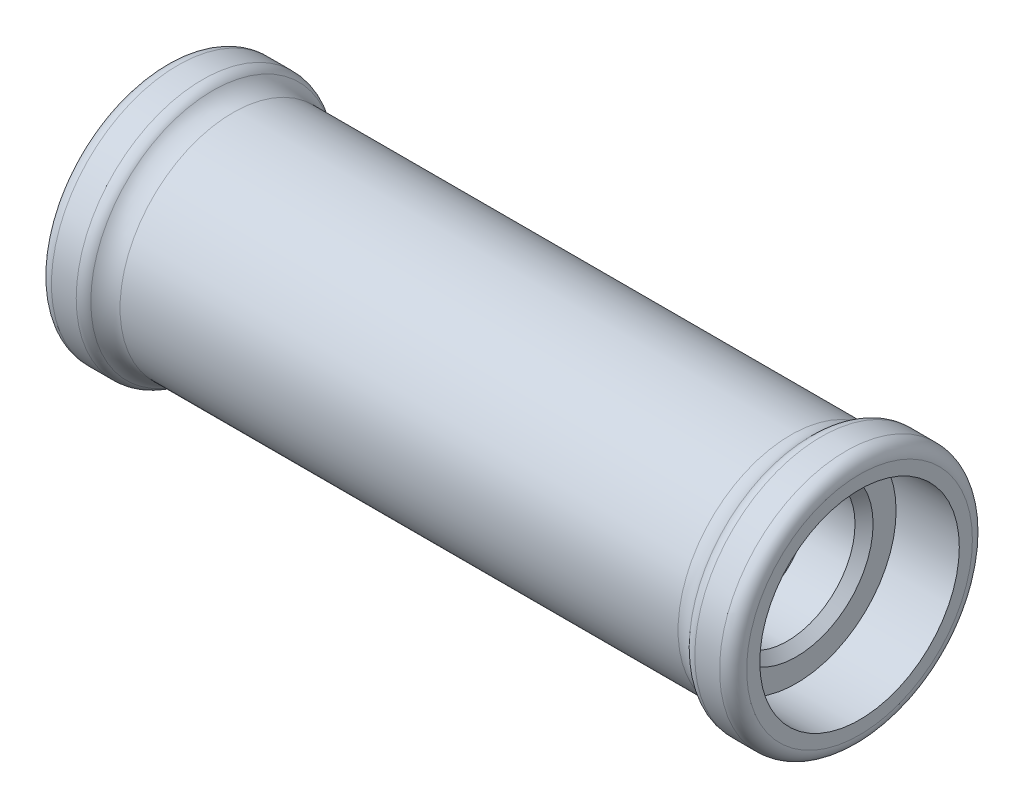
ISO-10303-21;
HEADER;
FILE_DESCRIPTION(('STEP AP214'),'2;1');
FILE_NAME('part.step','',(''),(''),'','','');
FILE_SCHEMA(('AUTOMOTIVE_DESIGN { 1 0 10303 214 1 1 1 1 }'));
ENDSEC;
DATA;
#1=APPLICATION_CONTEXT('core data for automotive mechanical design processes');
#2=APPLICATION_PROTOCOL_DEFINITION('international standard','automotive_design',2000,#1);
#3=PRODUCT_CONTEXT('',#1,'mechanical');
#4=PRODUCT('Part','Part','',(#3));
#5=PRODUCT_RELATED_PRODUCT_CATEGORY('part','',(#4));
#6=PRODUCT_DEFINITION_FORMATION('','',#4);
#7=PRODUCT_DEFINITION_CONTEXT('part definition',#1,'design');
#8=PRODUCT_DEFINITION('design','',#6,#7);
#9=PRODUCT_DEFINITION_SHAPE('','',#8);
#10=(LENGTH_UNIT() NAMED_UNIT(*) SI_UNIT(.MILLI.,.METRE.));
#11=(NAMED_UNIT(*) PLANE_ANGLE_UNIT() SI_UNIT($,.RADIAN.));
#12=(NAMED_UNIT(*) SI_UNIT($,.STERADIAN.) SOLID_ANGLE_UNIT());
#13=UNCERTAINTY_MEASURE_WITH_UNIT(LENGTH_MEASURE(1.E-05),#10,'distance_accuracy_value','');
#14=(GEOMETRIC_REPRESENTATION_CONTEXT(3) GLOBAL_UNCERTAINTY_ASSIGNED_CONTEXT((#13)) GLOBAL_UNIT_ASSIGNED_CONTEXT((#10,
#11,#12)) REPRESENTATION_CONTEXT('',''));
#15=CARTESIAN_POINT('',(0.,0.,0.));
#16=DIRECTION('',(0.,0.,1.));
#17=DIRECTION('',(1.,0.,0.));
#18=AXIS2_PLACEMENT_3D('',#15,#16,#17);
#19=CARTESIAN_POINT('',(38.5,0.,0.));
#20=DIRECTION('',(-1.,0.,0.));
#21=DIRECTION('',(0.,0.,1.));
#22=AXIS2_PLACEMENT_3D('',#19,#20,#21);
#23=CYLINDRICAL_SURFACE('',#22,12.5);
#24=CARTESIAN_POINT('',(30.9019237886467,0.,0.));
#25=DIRECTION('',(1.,0.,0.));
#26=DIRECTION('',(0.,0.,-1.));
#27=AXIS2_PLACEMENT_3D('',#24,#25,#26);
#28=CIRCLE('',#27,12.5);
#29=CARTESIAN_POINT('',(30.9019237886467,0.,-12.5));
#30=VERTEX_POINT('',#29);
#31=EDGE_CURVE('E72',#30,#30,#28,.F.);
#32=ORIENTED_EDGE('',*,*,#31,.T.);
#33=EDGE_LOOP('',(#32));
#34=FACE_BOUND('',#33,.T.);
#35=CARTESIAN_POINT('',(-30.9019237886467,0.,0.));
#36=DIRECTION('',(1.,0.,0.));
#37=DIRECTION('',(0.,0.,-1.));
#38=AXIS2_PLACEMENT_3D('',#35,#36,#37);
#39=CIRCLE('',#38,12.5);
#40=CARTESIAN_POINT('',(-30.9019237886467,0.,-12.5));
#41=VERTEX_POINT('',#40);
#42=EDGE_CURVE('E93',#41,#41,#39,.F.);
#43=ORIENTED_EDGE('',*,*,#42,.F.);
#44=EDGE_LOOP('',(#43));
#45=FACE_BOUND('',#44,.T.);
#46=ADVANCED_FACE('F39',(#34,#45),#23,.T.);
#47=CARTESIAN_POINT('',(33.5,0.,0.));
#48=DIRECTION('',(1.,0.,0.));
#49=DIRECTION('',(0.,0.,-1.));
#50=AXIS2_PLACEMENT_3D('',#47,#48,#49);
#51=CYLINDRICAL_SURFACE('',#50,14.);
#52=CARTESIAN_POINT('',(37.,0.,0.));
#53=DIRECTION('',(1.,0.,0.));
#54=DIRECTION('',(0.,0.,-1.));
#55=AXIS2_PLACEMENT_3D('',#52,#53,#54);
#56=CIRCLE('',#55,14.);
#57=CARTESIAN_POINT('',(37.,0.,-14.));
#58=VERTEX_POINT('',#57);
#59=EDGE_CURVE('E63',#58,#58,#56,.F.);
#60=ORIENTED_EDGE('',*,*,#59,.T.);
#61=EDGE_LOOP('',(#60));
#62=FACE_BOUND('',#61,.T.);
#63=CARTESIAN_POINT('',(34.2560257548966,0.,0.));
#64=DIRECTION('',(-1.,0.,0.));
#65=DIRECTION('',(0.,0.,1.));
#66=AXIS2_PLACEMENT_3D('',#63,#64,#65);
#67=CIRCLE('',#66,14.);
#68=CARTESIAN_POINT('',(34.2560257548966,0.,14.));
#69=VERTEX_POINT('',#68);
#70=EDGE_CURVE('E66',#69,#69,#67,.F.);
#71=ORIENTED_EDGE('',*,*,#70,.T.);
#72=EDGE_LOOP('',(#71));
#73=FACE_BOUND('',#72,.T.);
#74=ADVANCED_FACE('F126',(#62,#73),#51,.T.);
#75=CARTESIAN_POINT('',(38.5,0.,0.));
#76=DIRECTION('',(1.,0.,0.));
#77=DIRECTION('',(0.,0.,-1.));
#78=AXIS2_PLACEMENT_3D('',#75,#76,#77);
#79=PLANE('',#78);
#80=CARTESIAN_POINT('',(38.5,0.,0.));
#81=DIRECTION('',(1.,0.,0.));
#82=DIRECTION('',(0.,0.,-1.));
#83=AXIS2_PLACEMENT_3D('',#80,#81,#82);
#84=CIRCLE('',#83,12.5);
#85=CARTESIAN_POINT('',(38.5,0.,-12.5));
#86=VERTEX_POINT('',#85);
#87=EDGE_CURVE('E69',#86,#86,#84,.T.);
#88=ORIENTED_EDGE('',*,*,#87,.T.);
#89=EDGE_LOOP('',(#88));
#90=FACE_BOUND('',#89,.T.);
#91=CARTESIAN_POINT('',(38.5,0.,0.));
#92=DIRECTION('',(1.,0.,0.));
#93=DIRECTION('',(0.,0.,-1.));
#94=AXIS2_PLACEMENT_3D('',#91,#92,#93);
#95=CIRCLE('',#94,11.05);
#96=CARTESIAN_POINT('',(38.5,0.,11.05));
#97=VERTEX_POINT('',#96);
#98=EDGE_CURVE('E75',#97,#97,#95,.F.);
#99=ORIENTED_EDGE('',*,*,#98,.T.);
#100=EDGE_LOOP('',(#99));
#101=FACE_BOUND('',#100,.T.);
#102=ADVANCED_FACE('F134',(#90,#101),#79,.T.);
#103=CARTESIAN_POINT('',(38.500012,0.,0.));
#104=DIRECTION('',(-1.,0.,0.));
#105=DIRECTION('',(0.,0.,1.));
#106=AXIS2_PLACEMENT_3D('',#103,#104,#105);
#107=CYLINDRICAL_SURFACE('',#106,11.05);
#108=CARTESIAN_POINT('',(31.5,0.,0.));
#109=DIRECTION('',(1.,0.,0.));
#110=DIRECTION('',(0.,0.,-1.));
#111=AXIS2_PLACEMENT_3D('',#108,#109,#110);
#112=CIRCLE('',#111,11.05);
#113=CARTESIAN_POINT('',(31.5,0.,11.05));
#114=VERTEX_POINT('',#113);
#115=EDGE_CURVE('E78',#114,#114,#112,.T.);
#116=CARTESIAN_POINT('',(38.5,0.,11.05));
#117=CARTESIAN_POINT('',(38.4270833333333,0.,11.05));
#118=CARTESIAN_POINT('',(38.3541666666667,0.,11.05));
#119=CARTESIAN_POINT('',(38.2083333333333,0.,11.05));
#120=CARTESIAN_POINT('',(38.1354166666667,0.,11.05));
#121=CARTESIAN_POINT('',(37.9895833333333,0.,11.05));
#122=CARTESIAN_POINT('',(37.9166666666667,0.,11.05));
#123=CARTESIAN_POINT('',(37.7708333333333,0.,11.05));
#124=CARTESIAN_POINT('',(37.6979166666667,0.,11.05));
#125=CARTESIAN_POINT('',(37.5520833333333,0.,11.05));
#126=CARTESIAN_POINT('',(37.4791666666667,0.,11.05));
#127=CARTESIAN_POINT('',(37.3333333333333,0.,11.05));
#128=CARTESIAN_POINT('',(37.2604166666667,0.,11.05));
#129=CARTESIAN_POINT('',(37.1145833333333,0.,11.05));
#130=CARTESIAN_POINT('',(37.0416666666667,0.,11.05));
#131=CARTESIAN_POINT('',(36.8958333333333,0.,11.05));
#132=CARTESIAN_POINT('',(36.8229166666667,0.,11.05));
#133=CARTESIAN_POINT('',(36.6770833333333,0.,11.05));
#134=CARTESIAN_POINT('',(36.6041666666667,0.,11.05));
#135=CARTESIAN_POINT('',(36.4583333333333,0.,11.05));
#136=CARTESIAN_POINT('',(36.3854166666667,0.,11.05));
#137=CARTESIAN_POINT('',(36.2395833333333,0.,11.05));
#138=CARTESIAN_POINT('',(36.1666666666667,0.,11.05));
#139=CARTESIAN_POINT('',(36.0208333333333,0.,11.05));
#140=CARTESIAN_POINT('',(35.9479166666667,0.,11.05));
#141=CARTESIAN_POINT('',(35.8020833333333,0.,11.05));
#142=CARTESIAN_POINT('',(35.7291666666667,0.,11.05));
#143=CARTESIAN_POINT('',(35.5833333333333,0.,11.05));
#144=CARTESIAN_POINT('',(35.5104166666667,0.,11.05));
#145=CARTESIAN_POINT('',(35.3645833333333,0.,11.05));
#146=CARTESIAN_POINT('',(35.2916666666667,0.,11.05));
#147=CARTESIAN_POINT('',(35.1458333333333,0.,11.05));
#148=CARTESIAN_POINT('',(35.0729166666667,0.,11.05));
#149=CARTESIAN_POINT('',(34.9270833333333,0.,11.05));
#150=CARTESIAN_POINT('',(34.8541666666667,0.,11.05));
#151=CARTESIAN_POINT('',(34.7083333333333,0.,11.05));
#152=CARTESIAN_POINT('',(34.6354166666667,0.,11.05));
#153=CARTESIAN_POINT('',(34.4895833333333,0.,11.05));
#154=CARTESIAN_POINT('',(34.4166666666667,0.,11.05));
#155=CARTESIAN_POINT('',(34.2708333333333,0.,11.05));
#156=CARTESIAN_POINT('',(34.1979166666667,0.,11.05));
#157=CARTESIAN_POINT('',(34.0520833333333,0.,11.05));
#158=CARTESIAN_POINT('',(33.9791666666667,0.,11.05));
#159=CARTESIAN_POINT('',(33.8333333333333,0.,11.05));
#160=CARTESIAN_POINT('',(33.7604166666667,0.,11.05));
#161=CARTESIAN_POINT('',(33.6145833333333,0.,11.05));
#162=CARTESIAN_POINT('',(33.5416666666667,0.,11.05));
#163=CARTESIAN_POINT('',(33.3958333333333,0.,11.05));
#164=CARTESIAN_POINT('',(33.3229166666667,0.,11.05));
#165=CARTESIAN_POINT('',(33.1770833333333,0.,11.05));
#166=CARTESIAN_POINT('',(33.1041666666667,0.,11.05));
#167=CARTESIAN_POINT('',(32.9583333333333,0.,11.05));
#168=CARTESIAN_POINT('',(32.8854166666667,0.,11.05));
#169=CARTESIAN_POINT('',(32.7395833333333,0.,11.05));
#170=CARTESIAN_POINT('',(32.6666666666667,0.,11.05));
#171=CARTESIAN_POINT('',(32.5208333333333,0.,11.05));
#172=CARTESIAN_POINT('',(32.4479166666667,0.,11.05));
#173=CARTESIAN_POINT('',(32.3020833333333,0.,11.05));
#174=CARTESIAN_POINT('',(32.2291666666667,0.,11.05));
#175=CARTESIAN_POINT('',(32.0833333333333,0.,11.05));
#176=CARTESIAN_POINT('',(32.0104166666667,0.,11.05));
#177=CARTESIAN_POINT('',(31.8645833333333,0.,11.05));
#178=CARTESIAN_POINT('',(31.7916666666667,0.,11.05));
#179=CARTESIAN_POINT('',(31.6458333333333,0.,11.05));
#180=CARTESIAN_POINT('',(31.5729166666667,0.,11.05));
#181=CARTESIAN_POINT('',(31.5,0.,11.05));
#182=B_SPLINE_CURVE_WITH_KNOTS('',3,(#116,#117,#118,#119,#120,#121,#122,#123,#124,#125,#126,
#127,#128,#129,#130,#131,#132,#133,#134,#135,#136,#137,#138,#139,#140,#141,#142,#143,#144,#145,
#146,#147,#148,#149,#150,#151,#152,#153,#154,#155,#156,#157,#158,#159,#160,#161,#162,#163,#164,
#165,#166,#167,#168,#169,#170,#171,#172,#173,#174,#175,#176,#177,#178,#179,#180,#181),
.UNSPECIFIED.,.F.,.F.,(4,2,2,2,2,2,2,2,2,2,2,2,2,2,2,2,2,2,2,2,2,2,2,2,2,2,2,2,2,2,2,2,4),(0.,
0.218750000000004,0.4375,0.656250000000004,0.875000000000001,1.09375,1.3125,1.53125,1.75,
1.96875000000001,2.1875,2.40625000000001,2.625,2.84375000000001,3.0625,3.28125000000001,3.5,
3.71875000000001,3.9375,4.15625,4.375,4.59375,4.8125,5.03125,5.25,5.46875,5.68750000000001,
5.90625,6.12500000000001,6.34375,6.56250000000001,6.78125,7.00000000000001),.UNSPECIFIED.);
#183=EDGE_CURVE('BSEAM182',#97,#114,#182,.T.);
#184=ORIENTED_EDGE('',*,*,#98,.F.);
#185=ORIENTED_EDGE('',*,*,#115,.F.);
#186=ORIENTED_EDGE('',*,*,#183,.T.);
#187=ORIENTED_EDGE('',*,*,#183,.F.);
#188=EDGE_LOOP('',(#184,#186,#185,#187));
#189=FACE_BOUND('',#188,.T.);
#190=ADVANCED_FACE('F182',(#189),#107,.F.);
#191=CARTESIAN_POINT('',(31.5,0.,0.));
#192=DIRECTION('',(1.,0.,0.));
#193=DIRECTION('',(0.,0.,-1.));
#194=AXIS2_PLACEMENT_3D('',#191,#192,#193);
#195=PLANE('',#194);
#196=CARTESIAN_POINT('',(31.5,0.,0.));
#197=DIRECTION('',(1.,0.,0.));
#198=DIRECTION('',(0.,0.,-1.));
#199=AXIS2_PLACEMENT_3D('',#196,#197,#198);
#200=CIRCLE('',#199,8.50000000000001);
#201=CARTESIAN_POINT('',(31.5,0.,-8.50000000000001));
#202=VERTEX_POINT('',#201);
#203=EDGE_CURVE('E47',#202,#202,#200,.F.);
#204=ORIENTED_EDGE('',*,*,#203,.T.);
#205=EDGE_LOOP('',(#204));
#206=FACE_BOUND('',#205,.T.);
#207=ORIENTED_EDGE('',*,*,#115,.T.);
#208=EDGE_LOOP('',(#207));
#209=FACE_BOUND('',#208,.T.);
#210=ADVANCED_FACE('F174',(#206,#209),#195,.T.);
#211=CARTESIAN_POINT('',(24.5,0.,0.));
#212=DIRECTION('',(1.,0.,0.));
#213=DIRECTION('',(0.,0.,-1.));
#214=AXIS2_PLACEMENT_3D('',#211,#212,#213);
#215=CYLINDRICAL_SURFACE('',#214,7.5);
#216=CARTESIAN_POINT('',(30.5,0.,0.));
#217=DIRECTION('',(1.,0.,0.));
#218=DIRECTION('',(0.,0.,-1.));
#219=AXIS2_PLACEMENT_3D('',#216,#217,#218);
#220=CIRCLE('',#219,7.5);
#221=CARTESIAN_POINT('',(30.5,0.,-7.5));
#222=VERTEX_POINT('',#221);
#223=EDGE_CURVE('E51',#222,#222,#220,.T.);
#224=ORIENTED_EDGE('',*,*,#223,.T.);
#225=EDGE_LOOP('',(#224));
#226=FACE_BOUND('',#225,.T.);
#227=CARTESIAN_POINT('',(25.5,0.,0.));
#228=DIRECTION('',(1.,0.,0.));
#229=DIRECTION('',(0.,0.,-1.));
#230=AXIS2_PLACEMENT_3D('',#227,#228,#229);
#231=CIRCLE('',#230,7.5);
#232=CARTESIAN_POINT('',(25.5,0.,-7.5));
#233=VERTEX_POINT('',#232);
#234=EDGE_CURVE('E55',#233,#233,#231,.F.);
#235=ORIENTED_EDGE('',*,*,#234,.T.);
#236=EDGE_LOOP('',(#235));
#237=FACE_BOUND('',#236,.T.);
#238=ADVANCED_FACE('F171',(#226,#237),#215,.F.);
#239=CARTESIAN_POINT('',(24.5,0.,0.));
#240=DIRECTION('',(1.,0.,0.));
#241=DIRECTION('',(0.,0.,-1.));
#242=AXIS2_PLACEMENT_3D('',#239,#240,#241);
#243=PLANE('',#242);
#244=CARTESIAN_POINT('',(24.5,0.,0.));
#245=DIRECTION('',(1.,0.,0.));
#246=DIRECTION('',(0.,0.,-1.));
#247=AXIS2_PLACEMENT_3D('',#244,#245,#246);
#248=CIRCLE('',#247,6.49999999999999);
#249=CARTESIAN_POINT('',(24.5,0.,-6.49999999999999));
#250=VERTEX_POINT('',#249);
#251=EDGE_CURVE('E10',#250,#250,#248,.T.);
#252=ORIENTED_EDGE('',*,*,#251,.T.);
#253=EDGE_LOOP('',(#252));
#254=FACE_BOUND('',#253,.T.);
#255=ADVANCED_FACE('F144',(#254),#243,.T.);
#256=CARTESIAN_POINT('',(30.9019237886467,0.,0.));
#257=DIRECTION('',(1.,0.,0.));
#258=DIRECTION('',(0.,0.,-1.));
#259=AXIS2_PLACEMENT_3D('',#256,#257,#258);
#260=TOROIDAL_SURFACE('',#259,15.5,3.);
#261=CARTESIAN_POINT('',(33.1379917661466,0.,0.));
#262=DIRECTION('',(-1.,0.,0.));
#263=DIRECTION('',(0.,0.,1.));
#264=AXIS2_PLACEMENT_3D('',#261,#262,#263);
#265=CIRCLE('',#264,13.5000000000001);
#266=CARTESIAN_POINT('',(33.1379917661466,0.,13.5000000000001));
#267=VERTEX_POINT('',#266);
#268=EDGE_CURVE('E60',#267,#267,#265,.T.);
#269=ORIENTED_EDGE('',*,*,#268,.T.);
#270=EDGE_LOOP('',(#269));
#271=FACE_BOUND('',#270,.T.);
#272=ORIENTED_EDGE('',*,*,#31,.F.);
#273=EDGE_LOOP('',(#272));
#274=FACE_BOUND('',#273,.T.);
#275=ADVANCED_FACE('F140',(#271,#274),#260,.F.);
#276=CARTESIAN_POINT('',(37.,0.,0.));
#277=DIRECTION('',(1.,0.,0.));
#278=DIRECTION('',(0.,0.,-1.));
#279=AXIS2_PLACEMENT_3D('',#276,#277,#278);
#280=TOROIDAL_SURFACE('',#279,12.5,1.5);
#281=ORIENTED_EDGE('',*,*,#59,.F.);
#282=EDGE_LOOP('',(#281));
#283=FACE_BOUND('',#282,.T.);
#284=ORIENTED_EDGE('',*,*,#87,.F.);
#285=EDGE_LOOP('',(#284));
#286=FACE_BOUND('',#285,.T.);
#287=ADVANCED_FACE('F143',(#283,#286),#280,.T.);
#288=CARTESIAN_POINT('',(34.2560257548966,0.,0.));
#289=DIRECTION('',(-1.,0.,0.));
#290=DIRECTION('',(0.,0.,1.));
#291=AXIS2_PLACEMENT_3D('',#288,#289,#290);
#292=TOROIDAL_SURFACE('',#291,12.5000000000001,1.5);
#293=ORIENTED_EDGE('',*,*,#268,.F.);
#294=EDGE_LOOP('',(#293));
#295=FACE_BOUND('',#294,.T.);
#296=ORIENTED_EDGE('',*,*,#70,.F.);
#297=EDGE_LOOP('',(#296));
#298=FACE_BOUND('',#297,.T.);
#299=ADVANCED_FACE('F148',(#295,#298),#292,.T.);
#300=CARTESIAN_POINT('',(-33.5,0.,0.));
#301=DIRECTION('',(-1.,0.,0.));
#302=DIRECTION('',(0.,0.,-1.));
#303=AXIS2_PLACEMENT_3D('',#300,#301,#302);
#304=CYLINDRICAL_SURFACE('',#303,14.);
#305=CARTESIAN_POINT('',(-37.,0.,0.));
#306=DIRECTION('',(1.,0.,0.));
#307=DIRECTION('',(0.,0.,-1.));
#308=AXIS2_PLACEMENT_3D('',#305,#306,#307);
#309=CIRCLE('',#308,14.);
#310=CARTESIAN_POINT('',(-37.,0.,-14.));
#311=VERTEX_POINT('',#310);
#312=EDGE_CURVE('E84',#311,#311,#309,.F.);
#313=ORIENTED_EDGE('',*,*,#312,.F.);
#314=EDGE_LOOP('',(#313));
#315=FACE_BOUND('',#314,.T.);
#316=CARTESIAN_POINT('',(-34.2560257548966,0.,0.));
#317=DIRECTION('',(-1.,0.,0.));
#318=DIRECTION('',(0.,0.,1.));
#319=AXIS2_PLACEMENT_3D('',#316,#317,#318);
#320=CIRCLE('',#319,14.);
#321=CARTESIAN_POINT('',(-34.2560257548966,0.,14.));
#322=VERTEX_POINT('',#321);
#323=EDGE_CURVE('E87',#322,#322,#320,.F.);
#324=ORIENTED_EDGE('',*,*,#323,.F.);
#325=EDGE_LOOP('',(#324));
#326=FACE_BOUND('',#325,.T.);
#327=ADVANCED_FACE('F151',(#315,#326),#304,.T.);
#328=CARTESIAN_POINT('',(-38.5,0.,0.));
#329=DIRECTION('',(-1.,0.,0.));
#330=DIRECTION('',(0.,0.,-1.));
#331=AXIS2_PLACEMENT_3D('',#328,#329,#330);
#332=PLANE('',#331);
#333=CARTESIAN_POINT('',(-38.5,0.,0.));
#334=DIRECTION('',(1.,0.,0.));
#335=DIRECTION('',(0.,0.,-1.));
#336=AXIS2_PLACEMENT_3D('',#333,#334,#335);
#337=CIRCLE('',#336,12.5);
#338=CARTESIAN_POINT('',(-38.5,0.,-12.5));
#339=VERTEX_POINT('',#338);
#340=EDGE_CURVE('E90',#339,#339,#337,.T.);
#341=ORIENTED_EDGE('',*,*,#340,.F.);
#342=EDGE_LOOP('',(#341));
#343=FACE_BOUND('',#342,.T.);
#344=CARTESIAN_POINT('',(-38.5,0.,0.));
#345=DIRECTION('',(1.,0.,0.));
#346=DIRECTION('',(0.,0.,-1.));
#347=AXIS2_PLACEMENT_3D('',#344,#345,#346);
#348=CIRCLE('',#347,11.05);
#349=CARTESIAN_POINT('',(-38.5,0.,11.05));
#350=VERTEX_POINT('',#349);
#351=EDGE_CURVE('E96',#350,#350,#348,.F.);
#352=ORIENTED_EDGE('',*,*,#351,.F.);
#353=EDGE_LOOP('',(#352));
#354=FACE_BOUND('',#353,.T.);
#355=ADVANCED_FACE('F238',(#343,#354),#332,.T.);
#356=CARTESIAN_POINT('',(-38.500012,0.,0.));
#357=DIRECTION('',(1.,0.,0.));
#358=DIRECTION('',(0.,0.,1.));
#359=AXIS2_PLACEMENT_3D('',#356,#357,#358);
#360=CYLINDRICAL_SURFACE('',#359,11.05);
#361=CARTESIAN_POINT('',(-31.5,0.,0.));
#362=DIRECTION('',(1.,0.,0.));
#363=DIRECTION('',(0.,0.,-1.));
#364=AXIS2_PLACEMENT_3D('',#361,#362,#363);
#365=CIRCLE('',#364,11.05);
#366=CARTESIAN_POINT('',(-31.5,0.,11.05));
#367=VERTEX_POINT('',#366);
#368=EDGE_CURVE('E99',#367,#367,#365,.T.);
#369=CARTESIAN_POINT('',(-38.5,0.,11.05));
#370=CARTESIAN_POINT('',(-38.4270833333333,0.,11.05));
#371=CARTESIAN_POINT('',(-38.3541666666667,0.,11.05));
#372=CARTESIAN_POINT('',(-38.2083333333333,0.,11.05));
#373=CARTESIAN_POINT('',(-38.1354166666667,0.,11.05));
#374=CARTESIAN_POINT('',(-37.9895833333333,0.,11.05));
#375=CARTESIAN_POINT('',(-37.9166666666667,0.,11.05));
#376=CARTESIAN_POINT('',(-37.7708333333333,0.,11.05));
#377=CARTESIAN_POINT('',(-37.6979166666667,0.,11.05));
#378=CARTESIAN_POINT('',(-37.5520833333333,0.,11.05));
#379=CARTESIAN_POINT('',(-37.4791666666667,0.,11.05));
#380=CARTESIAN_POINT('',(-37.3333333333333,0.,11.05));
#381=CARTESIAN_POINT('',(-37.2604166666667,0.,11.05));
#382=CARTESIAN_POINT('',(-37.1145833333333,0.,11.05));
#383=CARTESIAN_POINT('',(-37.0416666666667,0.,11.05));
#384=CARTESIAN_POINT('',(-36.8958333333333,0.,11.05));
#385=CARTESIAN_POINT('',(-36.8229166666667,0.,11.05));
#386=CARTESIAN_POINT('',(-36.6770833333333,0.,11.05));
#387=CARTESIAN_POINT('',(-36.6041666666667,0.,11.05));
#388=CARTESIAN_POINT('',(-36.4583333333333,0.,11.05));
#389=CARTESIAN_POINT('',(-36.3854166666667,0.,11.05));
#390=CARTESIAN_POINT('',(-36.2395833333333,0.,11.05));
#391=CARTESIAN_POINT('',(-36.1666666666667,0.,11.05));
#392=CARTESIAN_POINT('',(-36.0208333333333,0.,11.05));
#393=CARTESIAN_POINT('',(-35.9479166666667,0.,11.05));
#394=CARTESIAN_POINT('',(-35.8020833333333,0.,11.05));
#395=CARTESIAN_POINT('',(-35.7291666666667,0.,11.05));
#396=CARTESIAN_POINT('',(-35.5833333333333,0.,11.05));
#397=CARTESIAN_POINT('',(-35.5104166666667,0.,11.05));
#398=CARTESIAN_POINT('',(-35.3645833333333,0.,11.05));
#399=CARTESIAN_POINT('',(-35.2916666666667,0.,11.05));
#400=CARTESIAN_POINT('',(-35.1458333333333,0.,11.05));
#401=CARTESIAN_POINT('',(-35.0729166666667,0.,11.05));
#402=CARTESIAN_POINT('',(-34.9270833333333,0.,11.05));
#403=CARTESIAN_POINT('',(-34.8541666666667,0.,11.05));
#404=CARTESIAN_POINT('',(-34.7083333333333,0.,11.05));
#405=CARTESIAN_POINT('',(-34.6354166666667,0.,11.05));
#406=CARTESIAN_POINT('',(-34.4895833333333,0.,11.05));
#407=CARTESIAN_POINT('',(-34.4166666666667,0.,11.05));
#408=CARTESIAN_POINT('',(-34.2708333333333,0.,11.05));
#409=CARTESIAN_POINT('',(-34.1979166666667,0.,11.05));
#410=CARTESIAN_POINT('',(-34.0520833333333,0.,11.05));
#411=CARTESIAN_POINT('',(-33.9791666666667,0.,11.05));
#412=CARTESIAN_POINT('',(-33.8333333333333,0.,11.05));
#413=CARTESIAN_POINT('',(-33.7604166666667,0.,11.05));
#414=CARTESIAN_POINT('',(-33.6145833333333,0.,11.05));
#415=CARTESIAN_POINT('',(-33.5416666666667,0.,11.05));
#416=CARTESIAN_POINT('',(-33.3958333333333,0.,11.05));
#417=CARTESIAN_POINT('',(-33.3229166666667,0.,11.05));
#418=CARTESIAN_POINT('',(-33.1770833333333,0.,11.05));
#419=CARTESIAN_POINT('',(-33.1041666666667,0.,11.05));
#420=CARTESIAN_POINT('',(-32.9583333333333,0.,11.05));
#421=CARTESIAN_POINT('',(-32.8854166666667,0.,11.05));
#422=CARTESIAN_POINT('',(-32.7395833333333,0.,11.05));
#423=CARTESIAN_POINT('',(-32.6666666666667,0.,11.05));
#424=CARTESIAN_POINT('',(-32.5208333333333,0.,11.05));
#425=CARTESIAN_POINT('',(-32.4479166666667,0.,11.05));
#426=CARTESIAN_POINT('',(-32.3020833333333,0.,11.05));
#427=CARTESIAN_POINT('',(-32.2291666666667,0.,11.05));
#428=CARTESIAN_POINT('',(-32.0833333333333,0.,11.05));
#429=CARTESIAN_POINT('',(-32.0104166666667,0.,11.05));
#430=CARTESIAN_POINT('',(-31.8645833333333,0.,11.05));
#431=CARTESIAN_POINT('',(-31.7916666666667,0.,11.05));
#432=CARTESIAN_POINT('',(-31.6458333333333,0.,11.05));
#433=CARTESIAN_POINT('',(-31.5729166666667,0.,11.05));
#434=CARTESIAN_POINT('',(-31.5,0.,11.05));
#435=B_SPLINE_CURVE_WITH_KNOTS('',3,(#369,#370,#371,#372,#373,#374,#375,#376,#377,#378,#379,
#380,#381,#382,#383,#384,#385,#386,#387,#388,#389,#390,#391,#392,#393,#394,#395,#396,#397,#398,
#399,#400,#401,#402,#403,#404,#405,#406,#407,#408,#409,#410,#411,#412,#413,#414,#415,#416,#417,
#418,#419,#420,#421,#422,#423,#424,#425,#426,#427,#428,#429,#430,#431,#432,#433,#434),
.UNSPECIFIED.,.F.,.F.,(4,2,2,2,2,2,2,2,2,2,2,2,2,2,2,2,2,2,2,2,2,2,2,2,2,2,2,2,2,2,2,2,4),(0.,
0.218749999999997,0.437499999999993,0.656249999999997,0.874999999999994,1.09375,
1.31249999999999,1.53125,1.74999999999999,1.96875,2.1875,2.40625,2.625,2.84375,3.0625,
3.28124999999999,3.5,3.71874999999999,3.9375,4.15624999999999,4.375,4.59374999999999,4.8125,
5.03124999999999,5.25,5.46874999999999,5.6875,5.90624999999999,6.125,6.34375,6.56249999999999,
6.78125,6.99999999999999),.UNSPECIFIED.);
#436=EDGE_CURVE('BSEAM247',#350,#367,#435,.T.);
#437=ORIENTED_EDGE('',*,*,#351,.T.);
#438=ORIENTED_EDGE('',*,*,#368,.T.);
#439=ORIENTED_EDGE('',*,*,#436,.T.);
#440=ORIENTED_EDGE('',*,*,#436,.F.);
#441=EDGE_LOOP('',(#437,#439,#438,#440));
#442=FACE_BOUND('',#441,.T.);
#443=ADVANCED_FACE('F247',(#442),#360,.F.);
#444=CARTESIAN_POINT('',(-31.5,0.,0.));
#445=DIRECTION('',(-1.,0.,0.));
#446=DIRECTION('',(0.,0.,-1.));
#447=AXIS2_PLACEMENT_3D('',#444,#445,#446);
#448=PLANE('',#447);
#449=CARTESIAN_POINT('',(-31.5,0.,0.));
#450=DIRECTION('',(1.,0.,0.));
#451=DIRECTION('',(0.,0.,-1.));
#452=AXIS2_PLACEMENT_3D('',#449,#450,#451);
#453=CIRCLE('',#452,7.5);
#454=CARTESIAN_POINT('',(-31.5,0.,-7.5));
#455=VERTEX_POINT('',#454);
#456=EDGE_CURVE('E103',#455,#455,#453,.T.);
#457=ORIENTED_EDGE('',*,*,#456,.T.);
#458=EDGE_LOOP('',(#457));
#459=FACE_BOUND('',#458,.T.);
#460=ORIENTED_EDGE('',*,*,#368,.F.);
#461=EDGE_LOOP('',(#460));
#462=FACE_BOUND('',#461,.T.);
#463=ADVANCED_FACE('F123',(#459,#462),#448,.T.);
#464=CARTESIAN_POINT('',(-24.5,0.,0.));
#465=DIRECTION('',(-1.,0.,0.));
#466=DIRECTION('',(0.,0.,-1.));
#467=AXIS2_PLACEMENT_3D('',#464,#465,#466);
#468=CYLINDRICAL_SURFACE('',#467,7.5);
#469=CARTESIAN_POINT('',(-24.5,0.,0.));
#470=DIRECTION('',(1.,0.,0.));
#471=DIRECTION('',(0.,0.,-1.));
#472=AXIS2_PLACEMENT_3D('',#469,#470,#471);
#473=CIRCLE('',#472,7.5);
#474=CARTESIAN_POINT('',(-24.5,0.,-7.5));
#475=VERTEX_POINT('',#474);
#476=EDGE_CURVE('E102',#475,#475,#473,.T.);
#477=ORIENTED_EDGE('',*,*,#476,.T.);
#478=EDGE_LOOP('',(#477));
#479=FACE_BOUND('',#478,.T.);
#480=ORIENTED_EDGE('',*,*,#456,.F.);
#481=EDGE_LOOP('',(#480));
#482=FACE_BOUND('',#481,.T.);
#483=ADVANCED_FACE('F109',(#479,#482),#468,.F.);
#484=CARTESIAN_POINT('',(-24.5,0.,0.));
#485=DIRECTION('',(-1.,0.,0.));
#486=DIRECTION('',(0.,0.,-1.));
#487=AXIS2_PLACEMENT_3D('',#484,#485,#486);
#488=PLANE('',#487);
#489=ORIENTED_EDGE('',*,*,#476,.F.);
#490=EDGE_LOOP('',(#489));
#491=FACE_BOUND('',#490,.T.);
#492=ADVANCED_FACE('F112',(#491),#488,.T.);
#493=CARTESIAN_POINT('',(-30.9019237886467,0.,0.));
#494=DIRECTION('',(-1.,0.,0.));
#495=DIRECTION('',(0.,0.,-1.));
#496=AXIS2_PLACEMENT_3D('',#493,#494,#495);
#497=TOROIDAL_SURFACE('',#496,15.5,3.);
#498=CARTESIAN_POINT('',(-33.1379917661466,0.,0.));
#499=DIRECTION('',(-1.,0.,0.));
#500=DIRECTION('',(0.,0.,1.));
#501=AXIS2_PLACEMENT_3D('',#498,#499,#500);
#502=CIRCLE('',#501,13.5000000000001);
#503=CARTESIAN_POINT('',(-33.1379917661466,0.,13.5000000000001));
#504=VERTEX_POINT('',#503);
#505=EDGE_CURVE('E81',#504,#504,#502,.T.);
#506=ORIENTED_EDGE('',*,*,#505,.F.);
#507=EDGE_LOOP('',(#506));
#508=FACE_BOUND('',#507,.T.);
#509=ORIENTED_EDGE('',*,*,#42,.T.);
#510=EDGE_LOOP('',(#509));
#511=FACE_BOUND('',#510,.T.);
#512=ADVANCED_FACE('F114',(#508,#511),#497,.F.);
#513=CARTESIAN_POINT('',(-37.,0.,0.));
#514=DIRECTION('',(-1.,0.,0.));
#515=DIRECTION('',(0.,0.,-1.));
#516=AXIS2_PLACEMENT_3D('',#513,#514,#515);
#517=TOROIDAL_SURFACE('',#516,12.5,1.5);
#518=ORIENTED_EDGE('',*,*,#312,.T.);
#519=EDGE_LOOP('',(#518));
#520=FACE_BOUND('',#519,.T.);
#521=ORIENTED_EDGE('',*,*,#340,.T.);
#522=EDGE_LOOP('',(#521));
#523=FACE_BOUND('',#522,.T.);
#524=ADVANCED_FACE('F120',(#520,#523),#517,.T.);
#525=CARTESIAN_POINT('',(-34.2560257548966,0.,0.));
#526=DIRECTION('',(1.,0.,0.));
#527=DIRECTION('',(0.,0.,1.));
#528=AXIS2_PLACEMENT_3D('',#525,#526,#527);
#529=TOROIDAL_SURFACE('',#528,12.5000000000001,1.5);
#530=ORIENTED_EDGE('',*,*,#505,.T.);
#531=EDGE_LOOP('',(#530));
#532=FACE_BOUND('',#531,.T.);
#533=ORIENTED_EDGE('',*,*,#323,.T.);
#534=EDGE_LOOP('',(#533));
#535=FACE_BOUND('',#534,.T.);
#536=ADVANCED_FACE('F158',(#532,#535),#529,.T.);
#537=CARTESIAN_POINT('',(30.5,0.,0.));
#538=DIRECTION('',(1.,0.,0.));
#539=DIRECTION('',(0.,0.,-1.));
#540=AXIS2_PLACEMENT_3D('',#537,#538,#539);
#541=CONICAL_SURFACE('',#540,7.5,0.785398163397455);
#542=ORIENTED_EDGE('',*,*,#203,.F.);
#543=EDGE_LOOP('',(#542));
#544=FACE_BOUND('',#543,.T.);
#545=ORIENTED_EDGE('',*,*,#223,.F.);
#546=EDGE_LOOP('',(#545));
#547=FACE_BOUND('',#546,.T.);
#548=ADVANCED_FACE('F154',(#544,#547),#541,.F.);
#549=CARTESIAN_POINT('',(24.5,0.,0.));
#550=DIRECTION('',(1.,0.,0.));
#551=DIRECTION('',(0.,0.,-1.));
#552=AXIS2_PLACEMENT_3D('',#549,#550,#551);
#553=CONICAL_SURFACE('',#552,6.49999999999999,0.785398163397455);
#554=ORIENTED_EDGE('',*,*,#234,.F.);
#555=EDGE_LOOP('',(#554));
#556=FACE_BOUND('',#555,.T.);
#557=ORIENTED_EDGE('',*,*,#251,.F.);
#558=EDGE_LOOP('',(#557));
#559=FACE_BOUND('',#558,.T.);
#560=ADVANCED_FACE('F42',(#556,#559),#553,.F.);
#561=CLOSED_SHELL('',(#46,#74,#102,#190,#210,#238,#255,#275,#287,#299,#327,#355,#443,#463,#483,
#492,#512,#524,#536,#548,#560));
#562=MANIFOLD_SOLID_BREP('B2',#561);
#563=ADVANCED_BREP_SHAPE_REPRESENTATION('',(#18,#562),#14);
#564=SHAPE_DEFINITION_REPRESENTATION(#9,#563);
ENDSEC;
END-ISO-10303-21;
